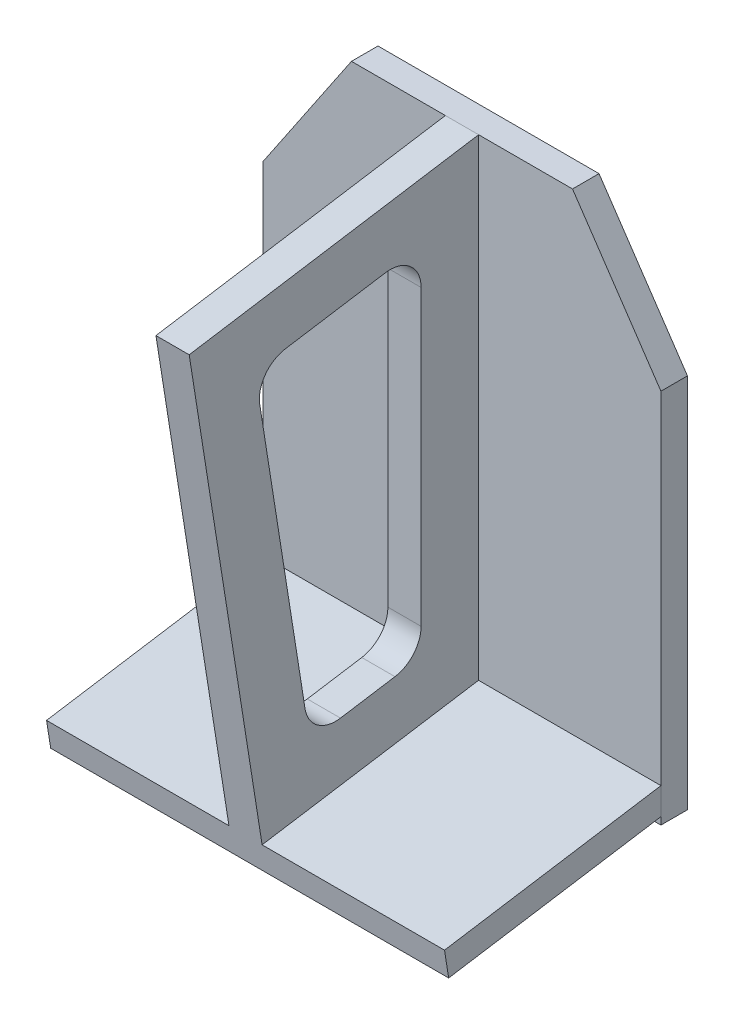
ISO-10303-21;
HEADER;
FILE_DESCRIPTION(('STEP AP214'),'2;1');
FILE_NAME('part.step','',(''),(''),'','','');
FILE_SCHEMA(('AUTOMOTIVE_DESIGN { 1 0 10303 214 1 1 1 1 }'));
ENDSEC;
DATA;
#1=APPLICATION_CONTEXT('core data for automotive mechanical design processes');
#2=APPLICATION_PROTOCOL_DEFINITION('international standard','automotive_design',2000,#1);
#3=PRODUCT_CONTEXT('',#1,'mechanical');
#4=PRODUCT('Part','Part','',(#3));
#5=PRODUCT_RELATED_PRODUCT_CATEGORY('part','',(#4));
#6=PRODUCT_DEFINITION_FORMATION('','',#4);
#7=PRODUCT_DEFINITION_CONTEXT('part definition',#1,'design');
#8=PRODUCT_DEFINITION('design','',#6,#7);
#9=PRODUCT_DEFINITION_SHAPE('','',#8);
#10=(LENGTH_UNIT() NAMED_UNIT(*) SI_UNIT(.MILLI.,.METRE.));
#11=(NAMED_UNIT(*) PLANE_ANGLE_UNIT() SI_UNIT($,.RADIAN.));
#12=(NAMED_UNIT(*) SI_UNIT($,.STERADIAN.) SOLID_ANGLE_UNIT());
#13=UNCERTAINTY_MEASURE_WITH_UNIT(LENGTH_MEASURE(1.E-05),#10,'distance_accuracy_value','');
#14=(GEOMETRIC_REPRESENTATION_CONTEXT(3) GLOBAL_UNCERTAINTY_ASSIGNED_CONTEXT((#13)) GLOBAL_UNIT_ASSIGNED_CONTEXT((#10,
#11,#12)) REPRESENTATION_CONTEXT('',''));
#15=CARTESIAN_POINT('',(0.,0.,0.));
#16=DIRECTION('',(0.,0.,1.));
#17=DIRECTION('',(1.,0.,0.));
#18=AXIS2_PLACEMENT_3D('',#15,#16,#17);
#19=CARTESIAN_POINT('',(-45.0187449333643,-42.3917888164907,-145.20068934011));
#20=DIRECTION('',(0.,-0.987688340595139,-0.156434465040224));
#21=DIRECTION('',(0.,0.156434465040224,-0.987688340595139));
#22=AXIS2_PLACEMENT_3D('',#19,#20,#21);
#23=PLANE('',#22);
#24=DIRECTION('',(-1.,0.,0.));
#25=VECTOR('',#24,1.);
#26=CARTESIAN_POINT('',(-45.0187449333643,-66.3396253743071,6.00000000000001));
#27=LINE('',#26,#25);
#28=CARTESIAN_POINT('',(45.,-66.3396253743071,6.00000000000001));
#29=VERTEX_POINT('',#28);
#30=CARTESIAN_POINT('',(-45.0187449333644,-66.3396253743071,6.00000000000001));
#31=VERTEX_POINT('',#30);
#32=EDGE_CURVE('E58',#29,#31,#27,.T.);
#33=ORIENTED_EDGE('',*,*,#32,.F.);
#34=DIRECTION('',(0.,-0.156434465040224,0.987688340595139));
#35=VECTOR('',#34,1.);
#36=CARTESIAN_POINT('',(45.,-42.3917888164907,-145.20068934011));
#37=LINE('',#36,#35);
#38=CARTESIAN_POINT('',(45.,-73.9442894436466,54.0139592863896));
#39=VERTEX_POINT('',#38);
#40=EDGE_CURVE('E328',#29,#39,#37,.T.);
#41=ORIENTED_EDGE('',*,*,#40,.T.);
#42=DIRECTION('',(1.,0.,0.));
#43=VECTOR('',#42,1.);
#44=CARTESIAN_POINT('',(-45.0187449333644,-73.9442894436466,54.0139592863896));
#45=LINE('',#44,#43);
#46=CARTESIAN_POINT('',(-45.0187449333644,-73.9442894436466,54.0139592863896));
#47=VERTEX_POINT('',#46);
#48=EDGE_CURVE('E269',#47,#39,#45,.T.);
#49=ORIENTED_EDGE('',*,*,#48,.F.);
#50=DIRECTION('',(0.,-0.156434465040224,0.987688340595139));
#51=VECTOR('',#50,1.);
#52=CARTESIAN_POINT('',(-45.0187449333643,-42.3917888164907,-145.20068934011));
#53=LINE('',#52,#51);
#54=EDGE_CURVE('E346',#31,#47,#53,.T.);
#55=ORIENTED_EDGE('',*,*,#54,.F.);
#56=EDGE_LOOP('',(#33,#41,#49,#55));
#57=FACE_BOUND('',#56,.T.);
#58=ADVANCED_FACE('F51',(#57),#23,.T.);
#59=CARTESIAN_POINT('',(-45.0187449333643,-42.3917888164907,-145.20068934011));
#60=DIRECTION('',(1.,0.,0.));
#61=DIRECTION('',(0.,0.,-1.));
#62=AXIS2_PLACEMENT_3D('',#59,#60,#61);
#63=PLANE('',#62);
#64=DIRECTION('',(0.,-0.156434465040224,0.987688340595139));
#65=VECTOR('',#64,1.);
#66=CARTESIAN_POINT('',(-45.0187449333643,-36.4656587729199,-144.262082549868));
#67=LINE('',#66,#65);
#68=CARTESIAN_POINT('',(-45.0187449333644,-60.2648346195791,6.00000000000001));
#69=VERTEX_POINT('',#68);
#70=CARTESIAN_POINT('',(-45.0187449333644,-68.0181594000758,54.9525660766309));
#71=VERTEX_POINT('',#70);
#72=EDGE_CURVE('E320',#69,#71,#67,.T.);
#73=ORIENTED_EDGE('',*,*,#72,.F.);
#74=DIRECTION('',(0.,-1.,0.));
#75=VECTOR('',#74,1.);
#76=CARTESIAN_POINT('',(-45.0187449333644,-42.3917888164907,6.00000000000001));
#77=LINE('',#76,#75);
#78=EDGE_CURVE('E353',#69,#31,#77,.T.);
#79=ORIENTED_EDGE('',*,*,#78,.T.);
#80=ORIENTED_EDGE('',*,*,#54,.T.);
#81=DIRECTION('',(0.,0.987688340595139,0.156434465040224));
#82=VECTOR('',#81,1.);
#83=CARTESIAN_POINT('',(-45.0187449333644,-73.9442894436466,54.0139592863896));
#84=LINE('',#83,#82);
#85=EDGE_CURVE('E329',#47,#71,#84,.T.);
#86=ORIENTED_EDGE('',*,*,#85,.T.);
#87=EDGE_LOOP('',(#73,#79,#80,#86));
#88=FACE_BOUND('',#87,.T.);
#89=ADVANCED_FACE('F352',(#88),#63,.F.);
#90=CARTESIAN_POINT('',(-45.0187449333643,-36.4656587729199,-144.262082549868));
#91=DIRECTION('',(0.,-0.987688340595139,-0.156434465040224));
#92=DIRECTION('',(0.,0.156434465040224,-0.987688340595139));
#93=AXIS2_PLACEMENT_3D('',#90,#91,#92);
#94=PLANE('',#93);
#95=DIRECTION('',(0.,-0.156434465040224,0.987688340595139));
#96=VECTOR('',#95,1.);
#97=CARTESIAN_POINT('',(-3.75925941834726,-36.4656587729199,-144.262082549868));
#98=LINE('',#97,#96);
#99=CARTESIAN_POINT('',(-3.75925941834727,-60.2648346195791,6.00000000000001));
#100=VERTEX_POINT('',#99);
#101=CARTESIAN_POINT('',(-3.75925941834727,-68.0181594000758,54.9525660766309));
#102=VERTEX_POINT('',#101);
#103=EDGE_CURVE('E317',#100,#102,#98,.T.);
#104=ORIENTED_EDGE('',*,*,#103,.F.);
#105=DIRECTION('',(-1.,0.,0.));
#106=VECTOR('',#105,1.);
#107=CARTESIAN_POINT('',(-45.0187449333643,-60.2648346195791,6.00000000000001));
#108=LINE('',#107,#106);
#109=EDGE_CURVE('E350',#100,#69,#108,.T.);
#110=ORIENTED_EDGE('',*,*,#109,.T.);
#111=ORIENTED_EDGE('',*,*,#72,.T.);
#112=DIRECTION('',(1.,0.,0.));
#113=VECTOR('',#112,1.);
#114=CARTESIAN_POINT('',(-45.0187449333644,-68.0181594000758,54.9525660766309));
#115=LINE('',#114,#113);
#116=EDGE_CURVE('E336',#71,#102,#115,.T.);
#117=ORIENTED_EDGE('',*,*,#116,.T.);
#118=EDGE_LOOP('',(#104,#110,#111,#117));
#119=FACE_BOUND('',#118,.T.);
#120=ADVANCED_FACE('F303',(#119),#94,.F.);
#121=CARTESIAN_POINT('',(-3.75925941834726,-36.4656587729199,-144.262082549868));
#122=DIRECTION('',(1.,0.,0.));
#123=DIRECTION('',(0.,0.,-1.));
#124=AXIS2_PLACEMENT_3D('',#121,#122,#123);
#125=PLANE('',#124);
#126=DIRECTION('',(0.,-1.,0.));
#127=VECTOR('',#126,1.);
#128=CARTESIAN_POINT('',(-3.75925941834727,0.,19.));
#129=LINE('',#128,#127);
#130=CARTESIAN_POINT('',(-3.75925941834727,23.2034513242065,19.));
#131=VERTEX_POINT('',#130);
#132=CARTESIAN_POINT('',(-3.75925941834727,-43.1832209103096,19.));
#133=VERTEX_POINT('',#132);
#134=EDGE_CURVE('E286',#131,#133,#129,.T.);
#135=ORIENTED_EDGE('',*,*,#134,.F.);
#136=CARTESIAN_POINT('',(-3.75925941834727,23.2034513242065,26.));
#137=DIRECTION('',(-1.,0.,0.));
#138=DIRECTION('',(0.,0.,1.));
#139=AXIS2_PLACEMENT_3D('',#136,#137,#138);
#140=CIRCLE('',#139,7.);
#141=CARTESIAN_POINT('',(-3.75925941834727,30.1172697083725,27.0950412552816));
#142=VERTEX_POINT('',#141);
#143=EDGE_CURVE('E179',#142,#131,#140,.T.);
#144=ORIENTED_EDGE('',*,*,#143,.F.);
#145=DIRECTION('',(0.,0.156434465040224,-0.987688340595139));
#146=VECTOR('',#145,1.);
#147=CARTESIAN_POINT('',(-3.75925941834727,33.5666617643555,5.31643693711022));
#148=LINE('',#147,#146);
#149=CARTESIAN_POINT('',(-3.75925941834727,26.5401898259492,49.6798347810463));
#150=VERTEX_POINT('',#149);
#151=EDGE_CURVE('E199',#150,#142,#148,.T.);
#152=ORIENTED_EDGE('',*,*,#151,.F.);
#153=CARTESIAN_POINT('',(-3.75925941834726,19.6263714417832,48.5847935257647));
#154=DIRECTION('',(-1.,0.,0.));
#155=DIRECTION('',(0.,0.,1.));
#156=AXIS2_PLACEMENT_3D('',#153,#154,#155);
#157=CIRCLE('',#156,7.);
#158=CARTESIAN_POINT('',(-3.75925941834726,18.5313301865017,55.4986119099307));
#159=VERTEX_POINT('',#158);
#160=EDGE_CURVE('E65',#150,#159,#157,.F.);
#161=ORIENTED_EDGE('',*,*,#160,.T.);
#162=DIRECTION('',(0.,0.987688340595139,0.156434465040224));
#163=VECTOR('',#162,1.);
#164=CARTESIAN_POINT('',(-3.75925941834726,-8.12151319368781,51.277216228102));
#165=LINE('',#164,#163);
#166=CARTESIAN_POINT('',(-3.75925941834726,-46.2307445426501,45.2413069496986));
#167=VERTEX_POINT('',#166);
#168=EDGE_CURVE('E186',#167,#159,#165,.T.);
#169=ORIENTED_EDGE('',*,*,#168,.F.);
#170=CARTESIAN_POINT('',(-3.75925941834726,-45.1357032873685,38.3274885655326));
#171=DIRECTION('',(-1.,0.,0.));
#172=DIRECTION('',(0.,0.,1.));
#173=AXIS2_PLACEMENT_3D('',#170,#171,#172);
#174=CIRCLE('',#173,6.99999999999999);
#175=CARTESIAN_POINT('',(-3.75925941834726,-52.0495216715345,37.2324473102511));
#176=VERTEX_POINT('',#175);
#177=EDGE_CURVE('E189',#176,#167,#174,.T.);
#178=ORIENTED_EDGE('',*,*,#177,.F.);
#179=DIRECTION('',(0.,-0.156434465040224,0.987688340595139));
#180=VECTOR('',#179,1.);
#181=CARTESIAN_POINT('',(-3.75925941834727,-45.0230497331283,-7.13095053368495));
#182=LINE('',#181,#180);
#183=CARTESIAN_POINT('',(-3.75925941834727,-50.0970392944756,24.9049587447184));
#184=VERTEX_POINT('',#183);
#185=EDGE_CURVE('E280',#184,#176,#182,.T.);
#186=ORIENTED_EDGE('',*,*,#185,.F.);
#187=CARTESIAN_POINT('',(-3.75925941834726,-43.1832209103096,26.));
#188=DIRECTION('',(-1.,0.,0.));
#189=DIRECTION('',(0.,0.,1.));
#190=AXIS2_PLACEMENT_3D('',#187,#188,#189);
#191=CIRCLE('',#190,7.);
#192=EDGE_CURVE('E283',#133,#184,#191,.T.);
#193=ORIENTED_EDGE('',*,*,#192,.F.);
#194=EDGE_LOOP('',(#135,#144,#152,#161,#169,#178,#186,#193));
#195=FACE_BOUND('',#194,.T.);
#196=DIRECTION('',(0.,-0.156434465040224,0.987688340595139));
#197=VECTOR('',#196,1.);
#198=CARTESIAN_POINT('',(-3.75925941834726,67.8039495800374,-127.747398988027));
#199=LINE('',#198,#197);
#200=CARTESIAN_POINT('',(-3.75925941834727,46.6204426464572,6.00000000000001));
#201=VERTEX_POINT('',#200);
#202=CARTESIAN_POINT('',(-3.75925941834727,36.2514489528815,71.467249638472));
#203=VERTEX_POINT('',#202);
#204=EDGE_CURVE('E308',#201,#203,#199,.T.);
#205=ORIENTED_EDGE('',*,*,#204,.F.);
#206=DIRECTION('',(0.,-1.,0.));
#207=VECTOR('',#206,1.);
#208=CARTESIAN_POINT('',(-3.75925941834727,-36.4656587729199,6.00000000000001));
#209=LINE('',#208,#207);
#210=EDGE_CURVE('E309',#201,#100,#209,.T.);
#211=ORIENTED_EDGE('',*,*,#210,.T.);
#212=ORIENTED_EDGE('',*,*,#103,.T.);
#213=DIRECTION('',(0.,0.987688340595139,0.156434465040224));
#214=VECTOR('',#213,1.);
#215=CARTESIAN_POINT('',(-3.75925941834727,-68.0181594000758,54.9525660766309));
#216=LINE('',#215,#214);
#217=EDGE_CURVE('E312',#102,#203,#216,.T.);
#218=ORIENTED_EDGE('',*,*,#217,.T.);
#219=EDGE_LOOP('',(#205,#211,#212,#218));
#220=FACE_BOUND('',#219,.T.);
#221=ADVANCED_FACE('F299',(#195,#220),#125,.F.);
#222=CARTESIAN_POINT('',(3.75925936190118,67.8033061474995,-127.74750089773));
#223=DIRECTION('',(8.66464555087981E-05,0.98768833688755,0.156434464453));
#224=DIRECTION('',(0.,-0.156434465040224,0.987688340595139));
#225=AXIS2_PLACEMENT_3D('',#222,#223,#224);
#226=PLANE('',#225);
#227=DIRECTION('',(0.99999999615203,-8.77265144675389E-05,0.));
#228=VECTOR('',#227,1.);
#229=CARTESIAN_POINT('',(3.75740100526487,46.6197832360352,6.00000000000001));
#230=LINE('',#229,#228);
#231=CARTESIAN_POINT('',(3.75925936190117,46.6197830730081,6.00000000000001));
#232=VERTEX_POINT('',#231);
#233=EDGE_CURVE('E374',#201,#232,#230,.T.);
#234=ORIENTED_EDGE('',*,*,#233,.F.);
#235=ORIENTED_EDGE('',*,*,#204,.T.);
#236=DIRECTION('',(-0.999999996246196,8.55796938600246E-05,1.35544919145867E-05));
#237=VECTOR('',#236,1.);
#238=CARTESIAN_POINT('',(3.75925936190117,36.2508055203436,71.4671477287695));
#239=LINE('',#238,#237);
#240=CARTESIAN_POINT('',(3.75925936190117,36.2508055203436,71.4671477287695));
#241=VERTEX_POINT('',#240);
#242=EDGE_CURVE('E362',#241,#203,#239,.T.);
#243=ORIENTED_EDGE('',*,*,#242,.F.);
#244=DIRECTION('',(0.,-0.156434465040224,0.987688340595139));
#245=VECTOR('',#244,1.);
#246=CARTESIAN_POINT('',(3.75925936190118,67.8033061474995,-127.74750089773));
#247=LINE('',#246,#245);
#248=EDGE_CURVE('E318',#232,#241,#247,.T.);
#249=ORIENTED_EDGE('',*,*,#248,.F.);
#250=EDGE_LOOP('',(#234,#235,#243,#249));
#251=FACE_BOUND('',#250,.T.);
#252=ADVANCED_FACE('F302',(#251),#226,.T.);
#253=CARTESIAN_POINT('',(3.74103068934827,-36.4656587729199,-144.262082549868));
#254=DIRECTION('',(0.999999985092328,-0.00017054532892281,-2.7011726471331E-05));
#255=DIRECTION('',(0.000170545328985027,0.999999985457145,0.));
#256=AXIS2_PLACEMENT_3D('',#253,#254,#255);
#257=PLANE('',#256);
#258=CARTESIAN_POINT('',(3.75701452468187,30.1159878429415,27.0948382277427));
#259=CARTESIAN_POINT('',(3.75701452812559,30.1463534726493,26.9032446763322));
#260=CARTESIAN_POINT('',(3.75701313247318,30.1687157477814,26.7103864389356));
#261=CARTESIAN_POINT('',(3.75700756784632,30.1973660636507,26.3234876479103));
#262=CARTESIAN_POINT('',(3.75700339899224,30.2036548019587,26.1294471459567));
#263=CARTESIAN_POINT('',(3.75699231267561,30.2000931171953,25.7415086789159));
#264=CARTESIAN_POINT('',(3.7569853951374,30.1902422497873,25.5476107178999));
#265=CARTESIAN_POINT('',(3.75696886041541,30.1544750457157,25.1613047116349));
#266=CARTESIAN_POINT('',(3.7569592432631,30.1285588963906,24.9688966490384));
#267=CARTESIAN_POINT('',(3.7569373773222,30.060844525822,24.5869302840453));
#268=CARTESIAN_POINT('',(3.75692512899122,30.0190490653326,24.3973714922305));
#269=CARTESIAN_POINT('',(3.75689807948741,29.9198468836659,24.0223108787127));
#270=CARTESIAN_POINT('',(3.75688327739899,29.8624345591598,23.8368105390422));
#271=CARTESIAN_POINT('',(3.75685123147513,29.732425413458,23.4712851855694));
#272=CARTESIAN_POINT('',(3.75683398852418,29.6598340880978,23.2912582169809));
#273=CARTESIAN_POINT('',(3.75679716919724,29.4999265139946,22.9377881576033));
#274=CARTESIAN_POINT('',(3.7567775919745,29.4126049170423,22.7643474862627));
#275=CARTESIAN_POINT('',(3.75673625271737,29.2238966077679,22.4253859670167));
#276=CARTESIAN_POINT('',(3.7567144915646,29.1225155648413,22.2598619627613));
#277=CARTESIAN_POINT('',(3.75666891808113,28.9063139901619,21.937730975055));
#278=CARTESIAN_POINT('',(3.75664510485091,28.7914875567679,21.7811279524973));
#279=CARTESIAN_POINT('',(3.75659560001632,28.5492245352752,21.4780000805437));
#280=CARTESIAN_POINT('',(3.756569908412,28.4217879474771,21.3314752309076));
#281=CARTESIAN_POINT('',(3.75651683607378,28.1552440502491,21.049578373414));
#282=CARTESIAN_POINT('',(3.7564894560887,28.0161419049003,20.9142014826581));
#283=CARTESIAN_POINT('',(3.75643317448652,27.7271206231435,20.6554112204641));
#284=CARTESIAN_POINT('',(3.75640427226232,27.5771971620278,20.5320026788363));
#285=CARTESIAN_POINT('',(3.75634516678606,27.267675194263,20.2981061308605));
#286=CARTESIAN_POINT('',(3.75631496401018,27.1080802201639,20.1876134496319));
#287=CARTESIAN_POINT('',(3.75625344500483,26.7802083643624,19.980222376519));
#288=CARTESIAN_POINT('',(3.75622212838024,26.6119283919925,19.8833288703376));
#289=CARTESIAN_POINT('',(3.75615862004782,26.2679656841446,19.703884645123));
#290=CARTESIAN_POINT('',(3.75612642865313,26.092285585634,19.6213288698028));
#291=CARTESIAN_POINT('',(3.75606137732855,25.7346514197878,19.4710797856242));
#292=CARTESIAN_POINT('',(3.75602851733187,25.5526967244347,19.4033879695077));
#293=CARTESIAN_POINT('',(3.75596236071219,25.1837983683697,19.2833391005152));
#294=CARTESIAN_POINT('',(3.75592906402329,24.9968539500066,19.2309843910815));
#295=CARTESIAN_POINT('',(3.75584918418011,24.5453283500299,19.1245765306235));
#296=CARTESIAN_POINT('',(3.75580249477503,24.2789624444129,19.0778581768251));
#297=CARTESIAN_POINT('',(3.75573262969302,23.8767175147777,19.0310604593292));
#298=CARTESIAN_POINT('',(3.75570935123289,23.7420794024904,19.0193411554927));
#299=CARTESIAN_POINT('',(3.75566293017138,23.472363113684,19.0037106243991));
#300=CARTESIAN_POINT('',(3.75563978755764,23.3372849789526,18.9997986761739));
#301=CARTESIAN_POINT('',(3.75561674423212,23.2021696971607,18.9997970102176));
#302=B_SPLINE_CURVE_WITH_KNOTS('',3,(#258,#259,#260,#261,#262,#263,#264,#265,#266,#267,#268,
#269,#270,#271,#272,#273,#274,#275,#276,#277,#278,#279,#280,#281,#282,#283,#284,#285,#286,#287,
#288,#289,#290,#291,#292,#293,#294,#295,#296,#297,#298,#299,#300,#301),.UNSPECIFIED.,.F.,.F.,(4,
2,2,2,2,2,2,2,2,2,2,2,2,2,2,2,2,2,2,2,2,4),(0.,0.581782421288514,1.16353959353716,
1.74531278230384,2.32707918709607,2.90874449307506,3.49061877640749,4.07228274515218,
4.65415835851557,5.23580001228437,5.8176979322825,6.39959583841204,6.98123749751297,
7.56311290901197,8.14477705494702,8.7266496402472,9.30831660615107,9.89004196039847,
10.4718561534121,11.2810832925742,11.6863358271109,12.0915509369805),.UNSPECIFIED.);
#303=CARTESIAN_POINT('',(3.75701452468189,30.1159878429415,27.0948382277427));
#304=VERTEX_POINT('',#303);
#305=CARTESIAN_POINT('',(3.75561674423212,23.2021696971605,18.9997970102176));
#306=VERTEX_POINT('',#305);
#307=EDGE_CURVE('E176',#304,#306,#302,.T.);
#308=ORIENTED_EDGE('',*,*,#307,.T.);
#309=DIRECTION('',(-0.000170545328860592,-0.999999985457145,4.60672394734375E-09));
#310=VECTOR('',#309,1.);
#311=CARTESIAN_POINT('',(3.75165950405289,-0.00128095215722737,18.9997971171095));
#312=LINE('',#311,#310);
#313=CARTESIAN_POINT('',(3.74429480754859,-43.1845006064522,18.9997973160427));
#314=VERTEX_POINT('',#313);
#315=EDGE_CURVE('E163',#306,#314,#312,.T.);
#316=ORIENTED_EDGE('',*,*,#315,.T.);
#317=CARTESIAN_POINT('',(3.74429480754857,-43.1845006064522,18.9997973160427));
#318=CARTESIAN_POINT('',(3.74426172379061,-43.3784855076339,18.9997773732333));
#319=CARTESIAN_POINT('',(3.74422885939141,-43.5724675239926,19.0078600877248));
#320=CARTESIAN_POINT('',(3.74416379411448,-43.9590848278375,19.0400868054963));
#321=CARTESIAN_POINT('',(3.74413159320827,-44.1517201728926,19.0642301179057));
#322=CARTESIAN_POINT('',(3.7440680759622,-44.5343253599667,19.1284349126551));
#323=CARTESIAN_POINT('',(3.74403675964672,-44.7242951284406,19.1684968333104));
#324=CARTESIAN_POINT('',(3.74397522892922,-45.1002498234566,19.2642552639821));
#325=CARTESIAN_POINT('',(3.74394501451391,-45.286234798025,19.319951585452));
#326=CARTESIAN_POINT('',(3.74388590117431,-45.6529051812936,19.4465848237091));
#327=CARTESIAN_POINT('',(3.74385700201955,-45.8335915164379,19.5175190579379));
#328=CARTESIAN_POINT('',(3.74380070279812,-46.1885158858344,19.6741722338399));
#329=CARTESIAN_POINT('',(3.74377330328084,-46.3627515494577,19.7598965466445));
#330=CARTESIAN_POINT('',(3.7437202147133,-46.7034326079426,19.9454824788213));
#331=CARTESIAN_POINT('',(3.74369452497963,-46.8698811074696,20.0453383990359));
#332=CARTESIAN_POINT('',(3.74364501036377,-47.1939849619261,20.2585710980649));
#333=CARTESIAN_POINT('',(3.74362118630839,-47.3516364095598,20.3719538158726));
#334=CARTESIAN_POINT('',(3.74357558025725,-47.6569774327213,20.6114214701389));
#335=CARTESIAN_POINT('',(3.74355379826171,-47.8046670072146,20.7375064079166));
#336=CARTESIAN_POINT('',(3.74351243597412,-48.0890009901891,21.0014490209764));
#337=CARTESIAN_POINT('',(3.74349285471601,-48.2256502375328,21.1393014835888));
#338=CARTESIAN_POINT('',(3.74345601069214,-48.4870846158562,21.4259321337858));
#339=CARTESIAN_POINT('',(3.74343874885409,-48.6118649937749,21.5747146565514));
#340=CARTESIAN_POINT('',(3.74340667784724,-48.8485958479145,21.8820750553067));
#341=CARTESIAN_POINT('',(3.74339186780613,-48.9605508828412,22.0406494197964));
#342=CARTESIAN_POINT('',(3.74336479415494,-49.1709169925713,22.3665562662148));
#343=CARTESIAN_POINT('',(3.74335253076307,-49.269326906531,22.5338894971015));
#344=CARTESIAN_POINT('',(3.74333063416043,-49.4519341739574,22.876193206849));
#345=CARTESIAN_POINT('',(3.74332100143764,-49.5361288894717,23.0511650956703));
#346=CARTESIAN_POINT('',(3.74330650215333,-49.670542696151,23.3630430789958));
#347=CARTESIAN_POINT('',(3.74330104606555,-49.7239993210419,23.4985653300032));
#348=CARTESIAN_POINT('',(3.74329167488479,-49.8223675327407,23.7727076885788));
#349=CARTESIAN_POINT('',(3.74328776003129,-49.8672777910496,23.9113282740347));
#350=CARTESIAN_POINT('',(3.74328148391454,-49.9484229745835,24.1913109462816));
#351=CARTESIAN_POINT('',(3.74327912500654,-49.9846446954197,24.3326768572603));
#352=CARTESIAN_POINT('',(3.74327597825153,-50.048187627136,24.6173752543804));
#353=CARTESIAN_POINT('',(3.74327519019587,-50.075510019727,24.7607074767858));
#354=CARTESIAN_POINT('',(3.74327519126377,-50.0983188167274,24.9047560883027));
#355=B_SPLINE_CURVE_WITH_KNOTS('',3,(#317,#318,#319,#320,#321,#322,#323,#324,#325,#326,#327,
#328,#329,#330,#331,#332,#333,#334,#335,#336,#337,#338,#339,#340,#341,#342,#343,#344,#345,#346,
#347,#348,#349,#350,#351,#352,#353,#354),.UNSPECIFIED.,.F.,.F.,(4,2,2,2,2,2,2,2,2,2,2,2,2,2,2,2,
2,2,4),(0.,0.581782289847959,1.16353955508497,1.74531283999031,2.32707910917445,
2.90874304512103,3.4906186631703,4.07226028092315,4.65415821707905,5.23605621366579,
5.81769777091278,6.39957128284534,6.98123732469325,7.56295318546821,8.14477687843942,
8.58156307810402,9.01841711910421,9.45593092056905,9.89338660238587),.UNSPECIFIED.);
#356=CARTESIAN_POINT('',(3.74327519126375,-50.0983188167274,24.9047560883027));
#357=VERTEX_POINT('',#356);
#358=EDGE_CURVE('E255',#314,#357,#355,.T.);
#359=ORIENTED_EDGE('',*,*,#358,.T.);
#360=DIRECTION('',(0.,-0.156434465040224,0.987688340595139));
#361=VECTOR('',#360,1.);
#362=CARTESIAN_POINT('',(3.74327519126376,-45.0243292553801,-7.13115319010069));
#363=LINE('',#362,#361);
#364=CARTESIAN_POINT('',(3.74327519126378,-52.0508011937863,37.2322446538354));
#365=VERTEX_POINT('',#364);
#366=EDGE_CURVE('E232',#357,#365,#363,.T.);
#367=ORIENTED_EDGE('',*,*,#366,.T.);
#368=CARTESIAN_POINT('',(3.74327519126375,-52.0508011937863,37.2322446538354));
#369=CARTESIAN_POINT('',(3.74327518782007,-52.081166825314,37.4238382170921));
#370=CARTESIAN_POINT('',(3.74327658347266,-52.1035291013485,37.6166964663487));
#371=CARTESIAN_POINT('',(3.74328214809985,-52.1321794152904,38.0035952574303));
#372=CARTESIAN_POINT('',(3.74328631695375,-52.138468152739,38.1976357474342));
#373=CARTESIAN_POINT('',(3.74329740326969,-52.1349064681117,38.5855741900858));
#374=CARTESIAN_POINT('',(3.74330432080739,-52.1250556017628,38.7794721386628));
#375=CARTESIAN_POINT('',(3.74332085552897,-52.0892884000998,39.1657781445187));
#376=CARTESIAN_POINT('',(3.74333047268173,-52.0633722500284,39.3581862189509));
#377=CARTESIAN_POINT('',(3.74335233863108,-51.9956578529323,39.7401527292499));
#378=CARTESIAN_POINT('',(3.74336458697168,-51.9538623568376,39.9297116527925));
#379=CARTESIAN_POINT('',(3.74339163647804,-51.8546601580813,40.304772252719));
#380=CARTESIAN_POINT('',(3.74340643855589,-51.7972478734237,40.4902724527065));
#381=CARTESIAN_POINT('',(3.74343848722113,-51.6672276044415,40.8558290650363));
#382=CARTESIAN_POINT('',(3.7434557333454,-51.5946224977118,41.0358865008842));
#383=CARTESIAN_POINT('',(3.74349255346886,-51.4347098907644,41.3893542724558));
#384=CARTESIAN_POINT('',(3.74351212751619,-51.3474020865208,41.5627644706352));
#385=CARTESIAN_POINT('',(3.7435534677781,-51.1586891881001,41.901734212922));
#386=CARTESIAN_POINT('',(3.7435752339696,-51.0572842423674,42.0672938396722));
#387=CARTESIAN_POINT('',(3.7436208083519,-50.8410767732163,42.3894208865939));
#388=CARTESIAN_POINT('',(3.74364461654345,-50.7262742449216,42.5459883034925));
#389=CARTESIAN_POINT('',(3.74369411072426,-50.4840633566007,42.8490509183574));
#390=CARTESIAN_POINT('',(3.74371979673196,-50.3566548727887,42.9955460173933));
#391=CARTESIAN_POINT('',(3.74377286834071,-50.0901159880432,43.2774475163094));
#392=CARTESIAN_POINT('',(3.74380025390771,-49.9509858218297,43.4128541381227));
#393=CARTESIAN_POINT('',(3.74385654132555,-49.6619346450557,43.6716709520797));
#394=CARTESIAN_POINT('',(3.74388544345694,-49.5120116360453,43.7950789125033));
#395=CARTESIAN_POINT('',(3.74394454868403,-49.2024910979488,44.0289752629459));
#396=CARTESIAN_POINT('',(3.74397475131926,-49.0428969851851,44.1394681752794));
#397=CARTESIAN_POINT('',(3.74403626333669,-48.7150621122674,44.3468340494163));
#398=CARTESIAN_POINT('',(3.7440675728194,-48.5468205661235,44.4437057701506));
#399=CARTESIAN_POINT('',(3.7441310774237,-48.2028801326402,44.6231526113039));
#400=CARTESIAN_POINT('',(3.74416327269424,-48.0271799883112,44.7057253099184));
#401=CARTESIAN_POINT('',(3.74424285762124,-47.5896421585768,44.8895303964344));
#402=CARTESIAN_POINT('',(3.74429062171297,-47.3243268163599,44.9826676761805));
#403=CARTESIAN_POINT('',(3.74436279298124,-46.9194161292902,45.0980116873543));
#404=CARTESIAN_POINT('',(3.7443869597764,-46.7831627349608,45.1324195157722));
#405=CARTESIAN_POINT('',(3.74443537849042,-46.5088485811072,45.1929752783317));
#406=CARTESIAN_POINT('',(3.74445963039942,-46.3707880258645,45.2191241378117));
#407=CARTESIAN_POINT('',(3.74448388963106,-46.2320242710402,45.2411042606338));
#408=B_SPLINE_CURVE_WITH_KNOTS('',3,(#368,#369,#370,#371,#372,#373,#374,#375,#376,#377,#378,
#379,#380,#381,#382,#383,#384,#385,#386,#387,#388,#389,#390,#391,#392,#393,#394,#395,#396,#397,
#398,#399,#400,#401,#402,#403,#404,#405,#406,#407),.UNSPECIFIED.,.F.,.F.,(4,2,2,2,2,2,2,2,2,2,2,
2,2,2,2,2,2,2,2,4),(0.,0.581782456946561,1.16353959353714,1.74531274435592,2.32707918709604,
2.90874489083088,3.49061877640771,4.07238255181309,4.65415835854897,5.23592803958589,
5.81769793236473,6.39947353847853,6.98123749764391,7.56310945722244,8.14477705508008,
8.72649761619001,9.30831660630835,10.1495453728737,10.5709257235906,10.9922588459153),.UNSPECIFIED.);
#409=CARTESIAN_POINT('',(3.74448388963104,-46.2320242710398,45.2411042606338));
#410=VERTEX_POINT('',#409);
#411=EDGE_CURVE('E221',#365,#410,#408,.T.);
#412=ORIENTED_EDGE('',*,*,#411,.T.);
#413=DIRECTION('',(0.000172671197900377,0.987688325871006,0.156434462708151));
#414=VECTOR('',#413,1.);
#415=CARTESIAN_POINT('',(3.75114628125756,-8.12279405831729,51.2770133590745));
#416=LINE('',#415,#414);
#417=CARTESIAN_POINT('',(3.7558058263146,18.5300485272085,55.4984089150408));
#418=VERTEX_POINT('',#417);
#419=EDGE_CURVE('E231',#410,#418,#416,.T.);
#420=ORIENTED_EDGE('',*,*,#419,.T.);
#421=CARTESIAN_POINT('',(3.75701452468186,26.5389079605182,49.6796317535074));
#422=CARTESIAN_POINT('',(3.75701452833753,26.5081296758221,49.8740935311472));
#423=CARTESIAN_POINT('',(3.75701309057836,26.469106897861,50.0672464326098));
#424=CARTESIAN_POINT('',(3.75700735863351,26.3749427899425,50.4495731232053));
#425=CARTESIAN_POINT('',(3.75700306458486,26.3198022332553,50.6387471027652));
#426=CARTESIAN_POINT('',(3.75699165077344,26.1938175950453,51.0116325724435));
#427=CARTESIAN_POINT('',(3.75698453314828,26.1229854108594,51.1953480821029));
#428=CARTESIAN_POINT('',(3.75696752396048,25.9661042947391,51.5561600433619));
#429=CARTESIAN_POINT('',(3.7569576324317,25.8800555485609,51.7332565757308));
#430=CARTESIAN_POINT('',(3.75693514194704,25.6933219263165,52.0796269831915));
#431=CARTESIAN_POINT('',(3.75692254217098,25.5926326194081,52.2488984695869));
#432=CARTESIAN_POINT('',(3.75689472147328,25.3773137983649,52.5784191273574));
#433=CARTESIAN_POINT('',(3.75687949958791,25.2626791632975,52.7386649525811));
#434=CARTESIAN_POINT('',(3.75684655224931,25.0203594591184,53.0488693209267));
#435=CARTESIAN_POINT('',(3.75682882772709,24.8926792479223,53.1988316589038));
#436=CARTESIAN_POINT('',(3.7567909964467,24.625137833744,53.4874714342402));
#437=CARTESIAN_POINT('',(3.75677088963814,24.4852763730406,53.6261486327173));
#438=CARTESIAN_POINT('',(3.7567284374465,24.1943719502275,53.8912260786439));
#439=CARTESIAN_POINT('',(3.75670609210945,24.0433292180897,54.0176265784721));
#440=CARTESIAN_POINT('',(3.75665932134185,23.7311332938187,54.2572554557222));
#441=CARTESIAN_POINT('',(3.75663489591046,23.5699800976769,54.3704838279219));
#442=CARTESIAN_POINT('',(3.75658413333145,23.2386745440712,54.5829854748781));
#443=CARTESIAN_POINT('',(3.75655779579095,23.0685203391031,54.6822558692715));
#444=CARTESIAN_POINT('',(3.75650340132428,22.720456994735,54.8661060836205));
#445=CARTESIAN_POINT('',(3.75647534443348,22.5425480148158,54.950686205511));
#446=CARTESIAN_POINT('',(3.75641769896032,22.1801658058852,55.1045867983701));
#447=CARTESIAN_POINT('',(3.7563881097878,21.9956900563484,55.1739013349557));
#448=CARTESIAN_POINT('',(3.75632763177094,21.6216230145305,55.2967135783183));
#449=CARTESIAN_POINT('',(3.75629674340296,21.432033606208,55.3502170256057));
#450=CARTESIAN_POINT('',(3.7562338839539,21.0490684623315,55.4410467732064));
#451=CARTESIAN_POINT('',(3.75620191318472,20.8556938242179,55.4783776918406));
#452=CARTESIAN_POINT('',(3.75613712163637,20.4665618684787,55.5366149912243));
#453=CARTESIAN_POINT('',(3.75610430106358,20.2708051353926,55.5575253220376));
#454=CARTESIAN_POINT('',(3.7560276313452,19.816622901892,55.5867326799372));
#455=CARTESIAN_POINT('',(3.75598354786326,19.5577740608576,55.5890272185074));
#456=CARTESIAN_POINT('',(3.75591706865992,19.1708209433434,55.5710292706979));
#457=CARTESIAN_POINT('',(3.75589486118519,19.0421209838242,55.561466850835));
#458=CARTESIAN_POINT('',(3.7558503797324,18.7854546965976,55.5352480254095));
#459=CARTESIAN_POINT('',(3.75582810575909,18.6574883184641,55.5185921135248));
#460=CARTESIAN_POINT('',(3.7558058263146,18.5300485272086,55.4984089150409));
#461=B_SPLINE_CURVE_WITH_KNOTS('',3,(#421,#422,#423,#424,#425,#426,#427,#428,#429,#430,#431,
#432,#433,#434,#435,#436,#437,#438,#439,#440,#441,#442,#443,#444,#445,#446,#447,#448,#449,#450,
#451,#452,#453,#454,#455,#456,#457,#458,#459,#460),.UNSPECIFIED.,.F.,.F.,(4,2,2,2,2,2,2,2,2,2,2,
2,2,2,2,2,2,2,2,4),(0.,0.590466964275523,1.18090560482376,1.77089809976054,2.36088339285718,
2.95104761311166,3.54142920839504,4.1315917529503,4.72176678673665,5.31192968540996,
5.90209281806152,6.4923775583754,7.08265016490017,7.67315183207042,8.26343884247178,
8.85355717580916,9.44353350937184,10.2183092178158,10.605308041672,10.9922799363952),.UNSPECIFIED.);
#462=CARTESIAN_POINT('',(3.75701452468186,26.5389079605182,49.6796317535074));
#463=VERTEX_POINT('',#462);
#464=EDGE_CURVE('E213',#463,#418,#461,.T.);
#465=ORIENTED_EDGE('',*,*,#464,.F.);
#466=DIRECTION('',(0.,0.156434465040224,-0.987688340595139));
#467=VECTOR('',#466,1.);
#468=CARTESIAN_POINT('',(3.75701452468187,33.5653798989245,5.31623390957136));
#469=LINE('',#468,#467);
#470=EDGE_CURVE('E185',#463,#304,#469,.T.);
#471=ORIENTED_EDGE('',*,*,#470,.T.);
#472=EDGE_LOOP('',(#308,#316,#359,#367,#412,#420,#465,#471));
#473=FACE_BOUND('',#472,.T.);
#474=DIRECTION('',(-0.000170545328985027,-0.999999985457145,0.));
#475=VECTOR('',#474,1.);
#476=CARTESIAN_POINT('',(3.74508952756357,-36.4656594651358,6.00000000000001));
#477=LINE('',#476,#475);
#478=CARTESIAN_POINT('',(3.74103068934825,-60.2648346195791,6.00000000000001));
#479=VERTEX_POINT('',#478);
#480=EDGE_CURVE('E376',#232,#479,#477,.T.);
#481=ORIENTED_EDGE('',*,*,#480,.F.);
#482=ORIENTED_EDGE('',*,*,#248,.T.);
#483=DIRECTION('',(0.000172671197900377,0.987688325871005,0.156434462708151));
#484=VECTOR('',#483,1.);
#485=CARTESIAN_POINT('',(3.74103068934825,-68.0181594000758,54.9525660766309));
#486=LINE('',#485,#484);
#487=CARTESIAN_POINT('',(3.74103068934825,-68.0181594000758,54.9525660766309));
#488=VERTEX_POINT('',#487);
#489=EDGE_CURVE('E363',#488,#241,#486,.T.);
#490=ORIENTED_EDGE('',*,*,#489,.F.);
#491=DIRECTION('',(0.,-0.156434465040224,0.987688340595139));
#492=VECTOR('',#491,1.);
#493=CARTESIAN_POINT('',(3.74103068934827,-36.4656587729199,-144.262082549868));
#494=LINE('',#493,#492);
#495=EDGE_CURVE('E322',#479,#488,#494,.T.);
#496=ORIENTED_EDGE('',*,*,#495,.F.);
#497=EDGE_LOOP('',(#481,#482,#490,#496));
#498=FACE_BOUND('',#497,.T.);
#499=ADVANCED_FACE('F182',(#473,#498),#257,.T.);
#500=CARTESIAN_POINT('',(3.74103068934827,-36.4656587729199,-144.262082549868));
#501=DIRECTION('',(0.,-0.987688340595139,-0.156434465040224));
#502=DIRECTION('',(0.,0.156434465040224,-0.987688340595139));
#503=AXIS2_PLACEMENT_3D('',#500,#501,#502);
#504=PLANE('',#503);
#505=DIRECTION('',(0.,-0.156434465040224,0.987688340595139));
#506=VECTOR('',#505,1.);
#507=CARTESIAN_POINT('',(45.,-36.4656587729199,-144.262082549868));
#508=LINE('',#507,#506);
#509=CARTESIAN_POINT('',(45.,-60.2648346195791,6.00000000000001));
#510=VERTEX_POINT('',#509);
#511=CARTESIAN_POINT('',(45.,-68.0181594000758,54.9525660766309));
#512=VERTEX_POINT('',#511);
#513=EDGE_CURVE('E327',#510,#512,#508,.T.);
#514=ORIENTED_EDGE('',*,*,#513,.F.);
#515=DIRECTION('',(-1.,0.,0.));
#516=VECTOR('',#515,1.);
#517=CARTESIAN_POINT('',(3.74103068934826,-60.2648346195791,6.00000000000001));
#518=LINE('',#517,#516);
#519=EDGE_CURVE('E347',#510,#479,#518,.T.);
#520=ORIENTED_EDGE('',*,*,#519,.T.);
#521=ORIENTED_EDGE('',*,*,#495,.T.);
#522=DIRECTION('',(1.,0.,0.));
#523=VECTOR('',#522,1.);
#524=CARTESIAN_POINT('',(3.74103068934825,-68.0181594000758,54.9525660766309));
#525=LINE('',#524,#523);
#526=EDGE_CURVE('E367',#488,#512,#525,.T.);
#527=ORIENTED_EDGE('',*,*,#526,.T.);
#528=EDGE_LOOP('',(#514,#520,#521,#527));
#529=FACE_BOUND('',#528,.T.);
#530=ADVANCED_FACE('F381',(#529),#504,.F.);
#531=CARTESIAN_POINT('',(45.,-42.3917888164907,-145.20068934011));
#532=DIRECTION('',(1.,0.,0.));
#533=DIRECTION('',(0.,0.,-1.));
#534=AXIS2_PLACEMENT_3D('',#531,#532,#533);
#535=PLANE('',#534);
#536=DIRECTION('',(0.,-1.,0.));
#537=VECTOR('',#536,1.);
#538=CARTESIAN_POINT('',(45.,-42.3917888164907,6.00000000000001));
#539=LINE('',#538,#537);
#540=EDGE_CURVE('E12',#510,#29,#539,.T.);
#541=ORIENTED_EDGE('',*,*,#540,.F.);
#542=ORIENTED_EDGE('',*,*,#513,.T.);
#543=DIRECTION('',(0.,0.987688340595139,0.156434465040224));
#544=VECTOR('',#543,1.);
#545=CARTESIAN_POINT('',(45.,-73.9442894436466,54.0139592863896));
#546=LINE('',#545,#544);
#547=EDGE_CURVE('E271',#39,#512,#546,.T.);
#548=ORIENTED_EDGE('',*,*,#547,.F.);
#549=ORIENTED_EDGE('',*,*,#40,.F.);
#550=EDGE_LOOP('',(#541,#542,#548,#549));
#551=FACE_BOUND('',#550,.T.);
#552=ADVANCED_FACE('F402',(#551),#535,.T.);
#553=CARTESIAN_POINT('',(0.,-10.1551612392107,64.1171646558388));
#554=DIRECTION('',(0.,-0.156434465040224,0.987688340595139));
#555=DIRECTION('',(0.,-0.987688340595139,-0.156434465040224));
#556=AXIS2_PLACEMENT_3D('',#553,#554,#555);
#557=PLANE('',#556);
#558=ORIENTED_EDGE('',*,*,#48,.T.);
#559=ORIENTED_EDGE('',*,*,#547,.T.);
#560=ORIENTED_EDGE('',*,*,#526,.F.);
#561=ORIENTED_EDGE('',*,*,#489,.T.);
#562=ORIENTED_EDGE('',*,*,#242,.T.);
#563=ORIENTED_EDGE('',*,*,#217,.F.);
#564=ORIENTED_EDGE('',*,*,#116,.F.);
#565=ORIENTED_EDGE('',*,*,#85,.F.);
#566=EDGE_LOOP('',(#558,#559,#560,#561,#562,#563,#564,#565));
#567=FACE_BOUND('',#566,.T.);
#568=ADVANCED_FACE('F359',(#567),#557,.T.);
#569=CARTESIAN_POINT('',(0.,0.,6.));
#570=DIRECTION('',(0.,0.,1.));
#571=DIRECTION('',(1.,0.,0.));
#572=AXIS2_PLACEMENT_3D('',#569,#570,#571);
#573=PLANE('',#572);
#574=ORIENTED_EDGE('',*,*,#32,.T.);
#575=ORIENTED_EDGE('',*,*,#78,.F.);
#576=ORIENTED_EDGE('',*,*,#109,.F.);
#577=ORIENTED_EDGE('',*,*,#210,.F.);
#578=ORIENTED_EDGE('',*,*,#233,.T.);
#579=ORIENTED_EDGE('',*,*,#480,.T.);
#580=ORIENTED_EDGE('',*,*,#519,.F.);
#581=ORIENTED_EDGE('',*,*,#540,.T.);
#582=EDGE_LOOP('',(#574,#575,#576,#577,#578,#579,#580,#581));
#583=FACE_BOUND('',#582,.T.);
#584=ADVANCED_FACE('F207',(#583),#573,.F.);
#585=CARTESIAN_POINT('',(93.851244859547,23.1868043084,25.9973633717184));
#586=DIRECTION('',(-1.,0.,0.));
#587=DIRECTION('',(0.,0.,1.));
#588=AXIS2_PLACEMENT_3D('',#585,#586,#587);
#589=CIRCLE('',#588,7.);
#590=DIRECTION('',(-0.999999985092329,0.00017054532892281,2.7011726471331E-05));
#591=VECTOR('',#590,1.);
#592=SURFACE_OF_LINEAR_EXTRUSION('',#589,#591);
#593=DIRECTION('',(-0.999999985092329,0.00017054532892281,2.7011726471331E-05));
#594=VECTOR('',#593,1.);
#595=CARTESIAN_POINT('',(93.851244859547,30.1006226925659,27.092404627));
#596=LINE('',#595,#594);
#597=EDGE_CURVE('E73',#304,#142,#596,.T.);
#598=ORIENTED_EDGE('',*,*,#597,.T.);
#599=ORIENTED_EDGE('',*,*,#143,.T.);
#600=DIRECTION('',(-0.999999985092329,0.00017054532892281,2.7011726471331E-05));
#601=VECTOR('',#600,1.);
#602=CARTESIAN_POINT('',(93.851244859547,23.1868043084,18.9973633717184));
#603=LINE('',#602,#601);
#604=EDGE_CURVE('E167',#306,#131,#603,.T.);
#605=ORIENTED_EDGE('',*,*,#604,.F.);
#606=ORIENTED_EDGE('',*,*,#307,.F.);
#607=EDGE_LOOP('',(#598,#599,#605,#606));
#608=FACE_BOUND('',#607,.T.);
#609=ADVANCED_FACE('F175',(#608),#592,.F.);
#610=CARTESIAN_POINT('',(93.851244859547,-0.0166470158065611,18.9973633717184));
#611=DIRECTION('',(-2.70117268641586E-05,0.,-0.999999999635183));
#612=DIRECTION('',(-0.999999999635183,0.,2.70117268641586E-05));
#613=AXIS2_PLACEMENT_3D('',#610,#611,#612);
#614=PLANE('',#613);
#615=ORIENTED_EDGE('',*,*,#604,.T.);
#616=ORIENTED_EDGE('',*,*,#134,.T.);
#617=DIRECTION('',(-0.999999985092329,0.00017054532892281,2.7011726471331E-05));
#618=VECTOR('',#617,1.);
#619=CARTESIAN_POINT('',(93.851244859547,-43.1998679261162,18.9973633717184));
#620=LINE('',#619,#618);
#621=EDGE_CURVE('E169',#314,#133,#620,.T.);
#622=ORIENTED_EDGE('',*,*,#621,.F.);
#623=ORIENTED_EDGE('',*,*,#315,.F.);
#624=EDGE_LOOP('',(#615,#616,#622,#623));
#625=FACE_BOUND('',#624,.T.);
#626=ADVANCED_FACE('F165',(#625),#614,.F.);
#627=CARTESIAN_POINT('',(93.851244859547,-43.1998679261162,25.9973633717184));
#628=DIRECTION('',(-1.,0.,0.));
#629=DIRECTION('',(0.,0.,1.));
#630=AXIS2_PLACEMENT_3D('',#627,#628,#629);
#631=CIRCLE('',#630,7.);
#632=DIRECTION('',(-0.999999985092329,0.00017054532892281,2.7011726471331E-05));
#633=VECTOR('',#632,1.);
#634=SURFACE_OF_LINEAR_EXTRUSION('',#631,#633);
#635=ORIENTED_EDGE('',*,*,#621,.T.);
#636=ORIENTED_EDGE('',*,*,#192,.T.);
#637=DIRECTION('',(-0.999999985092329,0.00017054532892281,2.7011726471331E-05));
#638=VECTOR('',#637,1.);
#639=CARTESIAN_POINT('',(93.851244859547,-50.1136863102822,24.9023221164368));
#640=LINE('',#639,#638);
#641=EDGE_CURVE('E260',#357,#184,#640,.T.);
#642=ORIENTED_EDGE('',*,*,#641,.F.);
#643=ORIENTED_EDGE('',*,*,#358,.F.);
#644=EDGE_LOOP('',(#635,#636,#642,#643));
#645=FACE_BOUND('',#644,.T.);
#646=ADVANCED_FACE('F251',(#645),#634,.F.);
#647=CARTESIAN_POINT('',(93.851244859547,-45.0396967489349,-7.13358716196654));
#648=DIRECTION('',(-0.000172671197900377,-0.987688325871006,-0.15643446270815));
#649=DIRECTION('',(0.,0.156434465040224,-0.987688340595139));
#650=AXIS2_PLACEMENT_3D('',#647,#648,#649);
#651=PLANE('',#650);
#652=ORIENTED_EDGE('',*,*,#641,.T.);
#653=ORIENTED_EDGE('',*,*,#185,.T.);
#654=DIRECTION('',(-0.999999985092329,0.00017054532892281,2.7011726471331E-05));
#655=VECTOR('',#654,1.);
#656=CARTESIAN_POINT('',(93.851244859547,-52.0661686873411,37.2298106819695));
#657=LINE('',#656,#655);
#658=EDGE_CURVE('E230',#365,#176,#657,.T.);
#659=ORIENTED_EDGE('',*,*,#658,.F.);
#660=ORIENTED_EDGE('',*,*,#366,.F.);
#661=EDGE_LOOP('',(#652,#653,#659,#660));
#662=FACE_BOUND('',#661,.T.);
#663=ADVANCED_FACE('F240',(#662),#651,.F.);
#664=CARTESIAN_POINT('',(93.851244859547,-45.1523503031751,38.3248519372511));
#665=DIRECTION('',(-1.,0.,0.));
#666=DIRECTION('',(0.,0.,1.));
#667=AXIS2_PLACEMENT_3D('',#664,#665,#666);
#668=CIRCLE('',#667,6.99999999999999);
#669=DIRECTION('',(-0.999999985092329,0.00017054532892281,2.7011726471331E-05));
#670=VECTOR('',#669,1.);
#671=SURFACE_OF_LINEAR_EXTRUSION('',#668,#670);
#672=ORIENTED_EDGE('',*,*,#658,.T.);
#673=ORIENTED_EDGE('',*,*,#177,.T.);
#674=DIRECTION('',(-0.999999985092329,0.00017054532892281,2.7011726471331E-05));
#675=VECTOR('',#674,1.);
#676=CARTESIAN_POINT('',(93.851244859547,-46.2473915584567,45.238670321417));
#677=LINE('',#676,#675);
#678=EDGE_CURVE('E229',#410,#167,#677,.T.);
#679=ORIENTED_EDGE('',*,*,#678,.F.);
#680=ORIENTED_EDGE('',*,*,#411,.F.);
#681=EDGE_LOOP('',(#672,#673,#679,#680));
#682=FACE_BOUND('',#681,.T.);
#683=ADVANCED_FACE('F233',(#682),#671,.F.);
#684=CARTESIAN_POINT('',(93.851244859547,-8.13816020949438,51.2745795998204));
#685=DIRECTION('',(0.,-0.156434465040224,0.987688340595139));
#686=DIRECTION('',(0.,-0.987688340595139,-0.156434465040224));
#687=AXIS2_PLACEMENT_3D('',#684,#685,#686);
#688=PLANE('',#687);
#689=ORIENTED_EDGE('',*,*,#678,.T.);
#690=ORIENTED_EDGE('',*,*,#168,.T.);
#691=DIRECTION('',(-0.999999985092329,0.00017054532892281,2.7011726471331E-05));
#692=VECTOR('',#691,1.);
#693=CARTESIAN_POINT('',(93.851244859547,18.5146831706951,55.4959752816491));
#694=LINE('',#693,#692);
#695=EDGE_CURVE('E264',#418,#159,#694,.T.);
#696=ORIENTED_EDGE('',*,*,#695,.F.);
#697=ORIENTED_EDGE('',*,*,#419,.F.);
#698=EDGE_LOOP('',(#689,#690,#696,#697));
#699=FACE_BOUND('',#698,.T.);
#700=ADVANCED_FACE('F239',(#699),#688,.F.);
#701=CARTESIAN_POINT('',(93.851244859547,19.6097244259767,48.5821568974831));
#702=DIRECTION('',(-1.,0.,0.));
#703=DIRECTION('',(0.,0.,1.));
#704=AXIS2_PLACEMENT_3D('',#701,#702,#703);
#705=CIRCLE('',#704,7.);
#706=DIRECTION('',(-0.999999985092329,0.00017054532892281,2.7011726471331E-05));
#707=VECTOR('',#706,1.);
#708=SURFACE_OF_LINEAR_EXTRUSION('',#705,#707);
#709=ORIENTED_EDGE('',*,*,#464,.T.);
#710=ORIENTED_EDGE('',*,*,#695,.T.);
#711=ORIENTED_EDGE('',*,*,#160,.F.);
#712=DIRECTION('',(-0.999999985092329,0.00017054532892281,2.7011726471331E-05));
#713=VECTOR('',#712,1.);
#714=CARTESIAN_POINT('',(93.851244859547,26.5235428101426,49.6771981527647));
#715=LINE('',#714,#713);
#716=EDGE_CURVE('E262',#463,#150,#715,.T.);
#717=ORIENTED_EDGE('',*,*,#716,.F.);
#718=EDGE_LOOP('',(#709,#710,#711,#717));
#719=FACE_BOUND('',#718,.T.);
#720=ADVANCED_FACE('F288',(#719),#708,.F.);
#721=CARTESIAN_POINT('',(93.851244859547,33.5500147485489,5.31380030882863));
#722=DIRECTION('',(0.000172671197900377,0.987688325871006,0.156434462708151));
#723=DIRECTION('',(0.,-0.156434465040224,0.987688340595139));
#724=AXIS2_PLACEMENT_3D('',#721,#722,#723);
#725=PLANE('',#724);
#726=ORIENTED_EDGE('',*,*,#716,.T.);
#727=ORIENTED_EDGE('',*,*,#151,.T.);
#728=ORIENTED_EDGE('',*,*,#597,.F.);
#729=ORIENTED_EDGE('',*,*,#470,.F.);
#730=EDGE_LOOP('',(#726,#727,#728,#729));
#731=FACE_BOUND('',#730,.T.);
#732=ADVANCED_FACE('F557',(#731),#725,.F.);
#733=CLOSED_SHELL('',(#58,#89,#120,#221,#252,#499,#530,#552,#568,#584,#609,#626,#646,#663,#683,
#700,#720,#732));
#734=MANIFOLD_SOLID_BREP('B2',#733);
#735=CARTESIAN_POINT('',(0.,-68.,6.));
#736=DIRECTION('',(0.,1.,0.));
#737=DIRECTION('',(-1.,0.,0.));
#738=AXIS2_PLACEMENT_3D('',#735,#736,#737);
#739=PLANE('',#738);
#740=DIRECTION('',(1.,0.,0.));
#741=VECTOR('',#740,1.);
#742=CARTESIAN_POINT('',(0.,-68.,0.));
#743=LINE('',#742,#741);
#744=CARTESIAN_POINT('',(-45.,-68.,0.));
#745=VERTEX_POINT('',#744);
#746=CARTESIAN_POINT('',(45.,-68.,0.));
#747=VERTEX_POINT('',#746);
#748=EDGE_CURVE('E679',#745,#747,#743,.T.);
#749=ORIENTED_EDGE('',*,*,#748,.T.);
#750=DIRECTION('',(0.,0.,-1.));
#751=VECTOR('',#750,1.);
#752=CARTESIAN_POINT('',(45.,-68.,6.));
#753=LINE('',#752,#751);
#754=CARTESIAN_POINT('',(45.,-68.,6.));
#755=VERTEX_POINT('',#754);
#756=EDGE_CURVE('E49',#755,#747,#753,.T.);
#757=ORIENTED_EDGE('',*,*,#756,.F.);
#758=DIRECTION('',(1.,0.,0.));
#759=VECTOR('',#758,1.);
#760=CARTESIAN_POINT('',(0.,-68.,6.));
#761=LINE('',#760,#759);
#762=CARTESIAN_POINT('',(-45.,-68.,6.));
#763=VERTEX_POINT('',#762);
#764=EDGE_CURVE('E691',#763,#755,#761,.T.);
#765=ORIENTED_EDGE('',*,*,#764,.F.);
#766=DIRECTION('',(0.,0.,-1.));
#767=VECTOR('',#766,1.);
#768=CARTESIAN_POINT('',(-45.,-68.,6.));
#769=LINE('',#768,#767);
#770=EDGE_CURVE('E610',#763,#745,#769,.T.);
#771=ORIENTED_EDGE('',*,*,#770,.T.);
#772=EDGE_LOOP('',(#749,#757,#765,#771));
#773=FACE_BOUND('',#772,.T.);
#774=ADVANCED_FACE('F594',(#773),#739,.F.);
#775=CARTESIAN_POINT('',(45.,0.,6.));
#776=DIRECTION('',(-1.,0.,0.));
#777=DIRECTION('',(0.,0.,1.));
#778=AXIS2_PLACEMENT_3D('',#775,#776,#777);
#779=PLANE('',#778);
#780=DIRECTION('',(0.,1.,0.));
#781=VECTOR('',#780,1.);
#782=CARTESIAN_POINT('',(45.,0.,0.));
#783=LINE('',#782,#781);
#784=CARTESIAN_POINT('',(45.,17.,0.));
#785=VERTEX_POINT('',#784);
#786=EDGE_CURVE('E681',#747,#785,#783,.T.);
#787=ORIENTED_EDGE('',*,*,#786,.T.);
#788=DIRECTION('',(0.,0.,-1.));
#789=VECTOR('',#788,1.);
#790=CARTESIAN_POINT('',(45.,17.,6.));
#791=LINE('',#790,#789);
#792=CARTESIAN_POINT('',(45.,17.,6.));
#793=VERTEX_POINT('',#792);
#794=EDGE_CURVE('E602',#793,#785,#791,.T.);
#795=ORIENTED_EDGE('',*,*,#794,.F.);
#796=DIRECTION('',(0.,1.,0.));
#797=VECTOR('',#796,1.);
#798=CARTESIAN_POINT('',(45.,0.,6.));
#799=LINE('',#798,#797);
#800=EDGE_CURVE('E642',#755,#793,#799,.T.);
#801=ORIENTED_EDGE('',*,*,#800,.F.);
#802=ORIENTED_EDGE('',*,*,#756,.T.);
#803=EDGE_LOOP('',(#787,#795,#801,#802));
#804=FACE_BOUND('',#803,.T.);
#805=ADVANCED_FACE('F711',(#804),#779,.F.);
#806=CARTESIAN_POINT('',(38.7926789922262,26.1931797949456,6.));
#807=DIRECTION('',(-0.828768206899582,-0.559592047149039,0.));
#808=DIRECTION('',(0.559592047149039,-0.828768206899582,0.));
#809=AXIS2_PLACEMENT_3D('',#806,#807,#808);
#810=PLANE('',#809);
#811=DIRECTION('',(-0.559592047149039,0.828768206899582,0.));
#812=VECTOR('',#811,1.);
#813=CARTESIAN_POINT('',(38.7926789922262,26.1931797949456,0.));
#814=LINE('',#813,#812);
#815=CARTESIAN_POINT('',(25.,46.6204426464571,0.));
#816=VERTEX_POINT('',#815);
#817=EDGE_CURVE('E683',#785,#816,#814,.T.);
#818=ORIENTED_EDGE('',*,*,#817,.T.);
#819=DIRECTION('',(0.,0.,-1.));
#820=VECTOR('',#819,1.);
#821=CARTESIAN_POINT('',(25.,46.6204426464571,6.));
#822=LINE('',#821,#820);
#823=CARTESIAN_POINT('',(25.,46.6204426464571,6.));
#824=VERTEX_POINT('',#823);
#825=EDGE_CURVE('E671',#824,#816,#822,.T.);
#826=ORIENTED_EDGE('',*,*,#825,.F.);
#827=DIRECTION('',(-0.559592047149039,0.828768206899582,0.));
#828=VECTOR('',#827,1.);
#829=CARTESIAN_POINT('',(38.7926789922262,26.1931797949456,6.));
#830=LINE('',#829,#828);
#831=EDGE_CURVE('E659',#793,#824,#830,.T.);
#832=ORIENTED_EDGE('',*,*,#831,.F.);
#833=ORIENTED_EDGE('',*,*,#794,.T.);
#834=EDGE_LOOP('',(#818,#826,#832,#833));
#835=FACE_BOUND('',#834,.T.);
#836=ADVANCED_FACE('F697',(#835),#810,.F.);
#837=CARTESIAN_POINT('',(0.,46.6204426464571,6.));
#838=DIRECTION('',(0.,-1.,0.));
#839=DIRECTION('',(1.,0.,0.));
#840=AXIS2_PLACEMENT_3D('',#837,#838,#839);
#841=PLANE('',#840);
#842=DIRECTION('',(-1.,0.,0.));
#843=VECTOR('',#842,1.);
#844=CARTESIAN_POINT('',(0.,46.6204426464571,0.));
#845=LINE('',#844,#843);
#846=CARTESIAN_POINT('',(-25.,46.6204426464571,0.));
#847=VERTEX_POINT('',#846);
#848=EDGE_CURVE('E668',#816,#847,#845,.T.);
#849=ORIENTED_EDGE('',*,*,#848,.T.);
#850=DIRECTION('',(0.,0.,-1.));
#851=VECTOR('',#850,1.);
#852=CARTESIAN_POINT('',(-25.,46.6204426464571,6.));
#853=LINE('',#852,#851);
#854=CARTESIAN_POINT('',(-25.,46.6204426464571,6.));
#855=VERTEX_POINT('',#854);
#856=EDGE_CURVE('E665',#855,#847,#853,.T.);
#857=ORIENTED_EDGE('',*,*,#856,.F.);
#858=DIRECTION('',(-1.,0.,0.));
#859=VECTOR('',#858,1.);
#860=CARTESIAN_POINT('',(0.,46.6204426464571,6.));
#861=LINE('',#860,#859);
#862=EDGE_CURVE('E652',#824,#855,#861,.T.);
#863=ORIENTED_EDGE('',*,*,#862,.F.);
#864=ORIENTED_EDGE('',*,*,#825,.T.);
#865=EDGE_LOOP('',(#849,#857,#863,#864));
#866=FACE_BOUND('',#865,.T.);
#867=ADVANCED_FACE('F666',(#866),#841,.F.);
#868=CARTESIAN_POINT('',(-38.7926789922263,26.1931797949456,6.));
#869=DIRECTION('',(-0.828768206899582,0.559592047149039,0.));
#870=DIRECTION('',(-0.559592047149039,-0.828768206899582,0.));
#871=AXIS2_PLACEMENT_3D('',#868,#869,#870);
#872=PLANE('',#871);
#873=DIRECTION('',(0.559592047149039,0.828768206899582,0.));
#874=VECTOR('',#873,1.);
#875=CARTESIAN_POINT('',(-38.7926789922263,26.1931797949456,0.));
#876=LINE('',#875,#874);
#877=CARTESIAN_POINT('',(-45.,17.,0.));
#878=VERTEX_POINT('',#877);
#879=EDGE_CURVE('E686',#878,#847,#876,.T.);
#880=ORIENTED_EDGE('',*,*,#879,.F.);
#881=DIRECTION('',(0.,0.,-1.));
#882=VECTOR('',#881,1.);
#883=CARTESIAN_POINT('',(-45.,17.,6.));
#884=LINE('',#883,#882);
#885=CARTESIAN_POINT('',(-45.,17.,6.));
#886=VERTEX_POINT('',#885);
#887=EDGE_CURVE('E630',#886,#878,#884,.T.);
#888=ORIENTED_EDGE('',*,*,#887,.F.);
#889=DIRECTION('',(0.559592047149039,0.828768206899582,0.));
#890=VECTOR('',#889,1.);
#891=CARTESIAN_POINT('',(-38.7926789922263,26.1931797949456,6.));
#892=LINE('',#891,#890);
#893=EDGE_CURVE('E657',#886,#855,#892,.T.);
#894=ORIENTED_EDGE('',*,*,#893,.T.);
#895=ORIENTED_EDGE('',*,*,#856,.T.);
#896=EDGE_LOOP('',(#880,#888,#894,#895));
#897=FACE_BOUND('',#896,.T.);
#898=ADVANCED_FACE('F673',(#897),#872,.T.);
#899=CARTESIAN_POINT('',(-45.,0.,6.));
#900=DIRECTION('',(-1.,0.,0.));
#901=DIRECTION('',(0.,-1.,0.));
#902=AXIS2_PLACEMENT_3D('',#899,#900,#901);
#903=PLANE('',#902);
#904=DIRECTION('',(0.,1.,0.));
#905=VECTOR('',#904,1.);
#906=CARTESIAN_POINT('',(-45.,0.,0.));
#907=LINE('',#906,#905);
#908=EDGE_CURVE('E688',#745,#878,#907,.T.);
#909=ORIENTED_EDGE('',*,*,#908,.F.);
#910=ORIENTED_EDGE('',*,*,#770,.F.);
#911=DIRECTION('',(0.,1.,0.));
#912=VECTOR('',#911,1.);
#913=CARTESIAN_POINT('',(-45.,0.,6.));
#914=LINE('',#913,#912);
#915=EDGE_CURVE('E674',#763,#886,#914,.T.);
#916=ORIENTED_EDGE('',*,*,#915,.T.);
#917=ORIENTED_EDGE('',*,*,#887,.T.);
#918=EDGE_LOOP('',(#909,#910,#916,#917));
#919=FACE_BOUND('',#918,.T.);
#920=ADVANCED_FACE('F700',(#919),#903,.T.);
#921=CARTESIAN_POINT('',(0.,0.,6.));
#922=DIRECTION('',(0.,0.,1.));
#923=DIRECTION('',(1.,0.,0.));
#924=AXIS2_PLACEMENT_3D('',#921,#922,#923);
#925=PLANE('',#924);
#926=ORIENTED_EDGE('',*,*,#764,.T.);
#927=ORIENTED_EDGE('',*,*,#800,.T.);
#928=ORIENTED_EDGE('',*,*,#831,.T.);
#929=ORIENTED_EDGE('',*,*,#862,.T.);
#930=ORIENTED_EDGE('',*,*,#893,.F.);
#931=ORIENTED_EDGE('',*,*,#915,.F.);
#932=EDGE_LOOP('',(#926,#927,#928,#929,#930,#931));
#933=FACE_BOUND('',#932,.T.);
#934=ADVANCED_FACE('F654',(#933),#925,.T.);
#935=CARTESIAN_POINT('',(0.,0.,0.));
#936=DIRECTION('',(0.,0.,1.));
#937=DIRECTION('',(1.,0.,0.));
#938=AXIS2_PLACEMENT_3D('',#935,#936,#937);
#939=PLANE('',#938);
#940=ORIENTED_EDGE('',*,*,#748,.F.);
#941=ORIENTED_EDGE('',*,*,#908,.T.);
#942=ORIENTED_EDGE('',*,*,#879,.T.);
#943=ORIENTED_EDGE('',*,*,#848,.F.);
#944=ORIENTED_EDGE('',*,*,#817,.F.);
#945=ORIENTED_EDGE('',*,*,#786,.F.);
#946=EDGE_LOOP('',(#940,#941,#942,#943,#944,#945));
#947=FACE_BOUND('',#946,.T.);
#948=ADVANCED_FACE('F699',(#947),#939,.F.);
#949=CLOSED_SHELL('',(#774,#805,#836,#867,#898,#920,#934,#948));
#950=MANIFOLD_SOLID_BREP('B6',#949);
#951=ADVANCED_BREP_SHAPE_REPRESENTATION('',(#18,#734,#950),#14);
#952=SHAPE_DEFINITION_REPRESENTATION(#9,#951);
ENDSEC;
END-ISO-10303-21;
